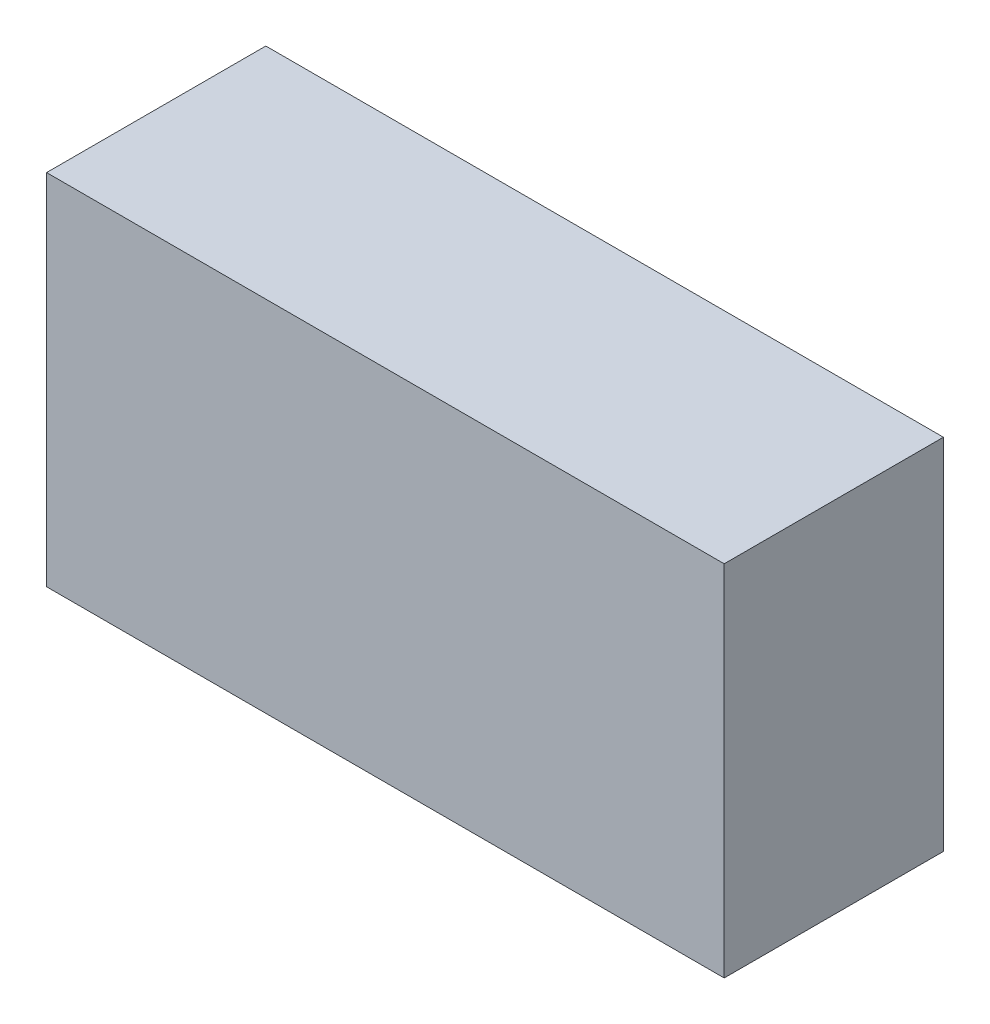
ISO-10303-21;
HEADER;
FILE_DESCRIPTION(('STEP AP214'),'2;1');
FILE_NAME('part.step','',(''),(''),'','','');
FILE_SCHEMA(('AUTOMOTIVE_DESIGN { 1 0 10303 214 1 1 1 1 }'));
ENDSEC;
DATA;
#1=APPLICATION_CONTEXT('core data for automotive mechanical design processes');
#2=APPLICATION_PROTOCOL_DEFINITION('international standard','automotive_design',2000,#1);
#3=PRODUCT_CONTEXT('',#1,'mechanical');
#4=PRODUCT('Part','Part','',(#3));
#5=PRODUCT_RELATED_PRODUCT_CATEGORY('part','',(#4));
#6=PRODUCT_DEFINITION_FORMATION('','',#4);
#7=PRODUCT_DEFINITION_CONTEXT('part definition',#1,'design');
#8=PRODUCT_DEFINITION('design','',#6,#7);
#9=PRODUCT_DEFINITION_SHAPE('','',#8);
#10=(LENGTH_UNIT() NAMED_UNIT(*) SI_UNIT(.MILLI.,.METRE.));
#11=(NAMED_UNIT(*) PLANE_ANGLE_UNIT() SI_UNIT($,.RADIAN.));
#12=(NAMED_UNIT(*) SI_UNIT($,.STERADIAN.) SOLID_ANGLE_UNIT());
#13=UNCERTAINTY_MEASURE_WITH_UNIT(LENGTH_MEASURE(1.E-05),#10,'distance_accuracy_value','');
#14=(GEOMETRIC_REPRESENTATION_CONTEXT(3) GLOBAL_UNCERTAINTY_ASSIGNED_CONTEXT((#13)) GLOBAL_UNIT_ASSIGNED_CONTEXT((#10,
#11,#12)) REPRESENTATION_CONTEXT('',''));
#15=CARTESIAN_POINT('',(0.,0.,0.));
#16=DIRECTION('',(0.,0.,1.));
#17=DIRECTION('',(1.,0.,0.));
#18=AXIS2_PLACEMENT_3D('',#15,#16,#17);
#19=CARTESIAN_POINT('',(3.,23.,23.));
#20=DIRECTION('',(1.,0.,0.));
#21=DIRECTION('',(0.,0.,-1.));
#22=AXIS2_PLACEMENT_3D('',#19,#20,#21);
#23=PLANE('',#22);
#24=DIRECTION('',(0.,-1.,0.));
#25=VECTOR('',#24,1.);
#26=CARTESIAN_POINT('',(3.,23.,12.));
#27=LINE('',#26,#25);
#28=CARTESIAN_POINT('',(3.,23.,12.));
#29=VERTEX_POINT('',#28);
#30=CARTESIAN_POINT('',(3.,5.,12.));
#31=VERTEX_POINT('',#30);
#32=EDGE_CURVE('E104',#29,#31,#27,.T.);
#33=ORIENTED_EDGE('',*,*,#32,.T.);
#34=DIRECTION('',(0.,0.,-1.));
#35=VECTOR('',#34,1.);
#36=CARTESIAN_POINT('',(3.,5.,23.));
#37=LINE('',#36,#35);
#38=CARTESIAN_POINT('',(3.,5.,23.));
#39=VERTEX_POINT('',#38);
#40=EDGE_CURVE('E11',#39,#31,#37,.T.);
#41=ORIENTED_EDGE('',*,*,#40,.F.);
#42=DIRECTION('',(0.,-1.,0.));
#43=VECTOR('',#42,1.);
#44=CARTESIAN_POINT('',(3.,23.,23.));
#45=LINE('',#44,#43);
#46=CARTESIAN_POINT('',(3.,23.,23.));
#47=VERTEX_POINT('',#46);
#48=EDGE_CURVE('E92',#47,#39,#45,.T.);
#49=ORIENTED_EDGE('',*,*,#48,.F.);
#50=DIRECTION('',(0.,0.,-1.));
#51=VECTOR('',#50,1.);
#52=CARTESIAN_POINT('',(3.,23.,23.));
#53=LINE('',#52,#51);
#54=EDGE_CURVE('E100',#47,#29,#53,.T.);
#55=ORIENTED_EDGE('',*,*,#54,.T.);
#56=EDGE_LOOP('',(#33,#41,#49,#55));
#57=FACE_BOUND('',#56,.T.);
#58=ADVANCED_FACE('F41',(#57),#23,.F.);
#59=CARTESIAN_POINT('',(3.,5.,23.));
#60=DIRECTION('',(0.,1.,0.));
#61=DIRECTION('',(0.,0.,1.));
#62=AXIS2_PLACEMENT_3D('',#59,#60,#61);
#63=PLANE('',#62);
#64=DIRECTION('',(1.,0.,0.));
#65=VECTOR('',#64,1.);
#66=CARTESIAN_POINT('',(3.,5.,12.));
#67=LINE('',#66,#65);
#68=CARTESIAN_POINT('',(37.,5.,12.));
#69=VERTEX_POINT('',#68);
#70=EDGE_CURVE('E96',#31,#69,#67,.T.);
#71=ORIENTED_EDGE('',*,*,#70,.T.);
#72=DIRECTION('',(0.,0.,-1.));
#73=VECTOR('',#72,1.);
#74=CARTESIAN_POINT('',(37.,5.,23.));
#75=LINE('',#74,#73);
#76=CARTESIAN_POINT('',(37.,5.,23.));
#77=VERTEX_POINT('',#76);
#78=EDGE_CURVE('E49',#77,#69,#75,.T.);
#79=ORIENTED_EDGE('',*,*,#78,.F.);
#80=DIRECTION('',(1.,0.,0.));
#81=VECTOR('',#80,1.);
#82=CARTESIAN_POINT('',(3.,5.,23.));
#83=LINE('',#82,#81);
#84=EDGE_CURVE('E87',#39,#77,#83,.T.);
#85=ORIENTED_EDGE('',*,*,#84,.F.);
#86=ORIENTED_EDGE('',*,*,#40,.T.);
#87=EDGE_LOOP('',(#71,#79,#85,#86));
#88=FACE_BOUND('',#87,.T.);
#89=ADVANCED_FACE('F95',(#88),#63,.F.);
#90=CARTESIAN_POINT('',(37.,5.,23.));
#91=DIRECTION('',(-1.,0.,0.));
#92=DIRECTION('',(0.,0.,1.));
#93=AXIS2_PLACEMENT_3D('',#90,#91,#92);
#94=PLANE('',#93);
#95=DIRECTION('',(0.,1.,0.));
#96=VECTOR('',#95,1.);
#97=CARTESIAN_POINT('',(37.,5.,12.));
#98=LINE('',#97,#96);
#99=CARTESIAN_POINT('',(37.,23.,12.));
#100=VERTEX_POINT('',#99);
#101=EDGE_CURVE('E74',#69,#100,#98,.T.);
#102=ORIENTED_EDGE('',*,*,#101,.T.);
#103=DIRECTION('',(0.,0.,-1.));
#104=VECTOR('',#103,1.);
#105=CARTESIAN_POINT('',(37.,23.,23.));
#106=LINE('',#105,#104);
#107=CARTESIAN_POINT('',(37.,23.,23.));
#108=VERTEX_POINT('',#107);
#109=EDGE_CURVE('E97',#108,#100,#106,.T.);
#110=ORIENTED_EDGE('',*,*,#109,.F.);
#111=DIRECTION('',(0.,1.,0.));
#112=VECTOR('',#111,1.);
#113=CARTESIAN_POINT('',(37.,5.,23.));
#114=LINE('',#113,#112);
#115=EDGE_CURVE('E90',#77,#108,#114,.T.);
#116=ORIENTED_EDGE('',*,*,#115,.F.);
#117=ORIENTED_EDGE('',*,*,#78,.T.);
#118=EDGE_LOOP('',(#102,#110,#116,#117));
#119=FACE_BOUND('',#118,.T.);
#120=ADVANCED_FACE('F98',(#119),#94,.F.);
#121=CARTESIAN_POINT('',(37.,23.,23.));
#122=DIRECTION('',(0.,-1.,0.));
#123=DIRECTION('',(0.,0.,-1.));
#124=AXIS2_PLACEMENT_3D('',#121,#122,#123);
#125=PLANE('',#124);
#126=DIRECTION('',(-1.,0.,0.));
#127=VECTOR('',#126,1.);
#128=CARTESIAN_POINT('',(37.,23.,12.));
#129=LINE('',#128,#127);
#130=EDGE_CURVE('E80',#100,#29,#129,.T.);
#131=ORIENTED_EDGE('',*,*,#130,.T.);
#132=ORIENTED_EDGE('',*,*,#54,.F.);
#133=DIRECTION('',(-1.,0.,0.));
#134=VECTOR('',#133,1.);
#135=CARTESIAN_POINT('',(37.,23.,23.));
#136=LINE('',#135,#134);
#137=EDGE_CURVE('E57',#108,#47,#136,.T.);
#138=ORIENTED_EDGE('',*,*,#137,.F.);
#139=ORIENTED_EDGE('',*,*,#109,.T.);
#140=EDGE_LOOP('',(#131,#132,#138,#139));
#141=FACE_BOUND('',#140,.T.);
#142=ADVANCED_FACE('F111',(#141),#125,.F.);
#143=CARTESIAN_POINT('',(0.,0.,23.));
#144=DIRECTION('',(0.,0.,1.));
#145=DIRECTION('',(1.,0.,0.));
#146=AXIS2_PLACEMENT_3D('',#143,#144,#145);
#147=PLANE('',#146);
#148=ORIENTED_EDGE('',*,*,#48,.T.);
#149=ORIENTED_EDGE('',*,*,#84,.T.);
#150=ORIENTED_EDGE('',*,*,#115,.T.);
#151=ORIENTED_EDGE('',*,*,#137,.T.);
#152=EDGE_LOOP('',(#148,#149,#150,#151));
#153=FACE_BOUND('',#152,.T.);
#154=ADVANCED_FACE('F88',(#153),#147,.T.);
#155=CARTESIAN_POINT('',(0.,0.,12.));
#156=DIRECTION('',(0.,0.,1.));
#157=DIRECTION('',(1.,0.,0.));
#158=AXIS2_PLACEMENT_3D('',#155,#156,#157);
#159=PLANE('',#158);
#160=ORIENTED_EDGE('',*,*,#32,.F.);
#161=ORIENTED_EDGE('',*,*,#130,.F.);
#162=ORIENTED_EDGE('',*,*,#101,.F.);
#163=ORIENTED_EDGE('',*,*,#70,.F.);
#164=EDGE_LOOP('',(#160,#161,#162,#163));
#165=FACE_BOUND('',#164,.T.);
#166=ADVANCED_FACE('F114',(#165),#159,.F.);
#167=CLOSED_SHELL('',(#58,#89,#120,#142,#154,#166));
#168=MANIFOLD_SOLID_BREP('B2',#167);
#169=ADVANCED_BREP_SHAPE_REPRESENTATION('',(#18,#168),#14);
#170=SHAPE_DEFINITION_REPRESENTATION(#9,#169);
ENDSEC;
END-ISO-10303-21;
